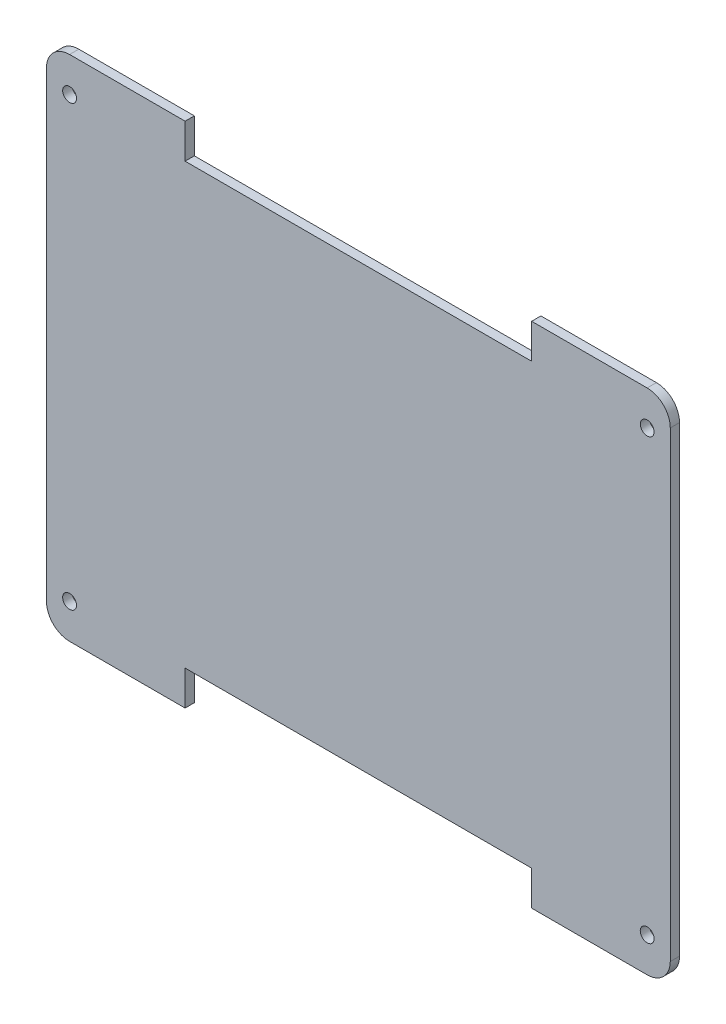
ISO-10303-21;
HEADER;
FILE_DESCRIPTION(('STEP AP214'),'2;1');
FILE_NAME('part.step','',(''),(''),'','','');
FILE_SCHEMA(('AUTOMOTIVE_DESIGN { 1 0 10303 214 1 1 1 1 }'));
ENDSEC;
DATA;
#1=APPLICATION_CONTEXT('core data for automotive mechanical design processes');
#2=APPLICATION_PROTOCOL_DEFINITION('international standard','automotive_design',2000,#1);
#3=PRODUCT_CONTEXT('',#1,'mechanical');
#4=PRODUCT('Part','Part','',(#3));
#5=PRODUCT_RELATED_PRODUCT_CATEGORY('part','',(#4));
#6=PRODUCT_DEFINITION_FORMATION('','',#4);
#7=PRODUCT_DEFINITION_CONTEXT('part definition',#1,'design');
#8=PRODUCT_DEFINITION('design','',#6,#7);
#9=PRODUCT_DEFINITION_SHAPE('','',#8);
#10=(LENGTH_UNIT() NAMED_UNIT(*) SI_UNIT(.MILLI.,.METRE.));
#11=(NAMED_UNIT(*) PLANE_ANGLE_UNIT() SI_UNIT($,.RADIAN.));
#12=(NAMED_UNIT(*) SI_UNIT($,.STERADIAN.) SOLID_ANGLE_UNIT());
#13=UNCERTAINTY_MEASURE_WITH_UNIT(LENGTH_MEASURE(1.E-05),#10,'distance_accuracy_value','');
#14=(GEOMETRIC_REPRESENTATION_CONTEXT(3) GLOBAL_UNCERTAINTY_ASSIGNED_CONTEXT((#13)) GLOBAL_UNIT_ASSIGNED_CONTEXT((#10,
#11,#12)) REPRESENTATION_CONTEXT('',''));
#15=CARTESIAN_POINT('',(0.,0.,0.));
#16=DIRECTION('',(0.,0.,1.));
#17=DIRECTION('',(1.,0.,0.));
#18=AXIS2_PLACEMENT_3D('',#15,#16,#17);
#19=CARTESIAN_POINT('',(-125.,100.,14.));
#20=DIRECTION('',(0.,0.,-1.));
#21=DIRECTION('',(-1.,0.,0.));
#22=AXIS2_PLACEMENT_3D('',#19,#20,#21);
#23=PLANE('',#22);
#24=DIRECTION('',(0.,1.,0.));
#25=VECTOR('',#24,1.);
#26=CARTESIAN_POINT('',(135.,50.,14.));
#27=LINE('',#26,#25);
#28=CARTESIAN_POINT('',(135.,-100.,14.));
#29=VERTEX_POINT('',#28);
#30=CARTESIAN_POINT('',(135.,99.9999999999999,14.));
#31=VERTEX_POINT('',#30);
#32=EDGE_CURVE('E144',#29,#31,#27,.T.);
#33=ORIENTED_EDGE('',*,*,#32,.T.);
#34=CARTESIAN_POINT('',(125.,99.9999999999999,14.));
#35=DIRECTION('',(0.,0.,1.));
#36=DIRECTION('',(-1.,0.,0.));
#37=AXIS2_PLACEMENT_3D('',#34,#35,#36);
#38=CIRCLE('',#37,10.);
#39=CARTESIAN_POINT('',(125.,110.,14.));
#40=VERTEX_POINT('',#39);
#41=EDGE_CURVE('E147',#31,#40,#38,.T.);
#42=ORIENTED_EDGE('',*,*,#41,.T.);
#43=DIRECTION('',(-1.,0.,0.));
#44=VECTOR('',#43,1.);
#45=CARTESIAN_POINT('',(75.,110.,14.));
#46=LINE('',#45,#44);
#47=CARTESIAN_POINT('',(75.,110.,14.));
#48=VERTEX_POINT('',#47);
#49=EDGE_CURVE('E150',#40,#48,#46,.T.);
#50=ORIENTED_EDGE('',*,*,#49,.T.);
#51=DIRECTION('',(0.,-1.,0.));
#52=VECTOR('',#51,1.);
#53=CARTESIAN_POINT('',(75.,110.,14.));
#54=LINE('',#53,#52);
#55=CARTESIAN_POINT('',(75.,95.,14.));
#56=VERTEX_POINT('',#55);
#57=EDGE_CURVE('E153',#48,#56,#54,.T.);
#58=ORIENTED_EDGE('',*,*,#57,.T.);
#59=DIRECTION('',(-1.,0.,0.));
#60=VECTOR('',#59,1.);
#61=CARTESIAN_POINT('',(-75.,95.,14.));
#62=LINE('',#61,#60);
#63=CARTESIAN_POINT('',(-75.,95.,14.));
#64=VERTEX_POINT('',#63);
#65=EDGE_CURVE('E156',#56,#64,#62,.T.);
#66=ORIENTED_EDGE('',*,*,#65,.T.);
#67=DIRECTION('',(0.,1.,0.));
#68=VECTOR('',#67,1.);
#69=CARTESIAN_POINT('',(-75.,110.,14.));
#70=LINE('',#69,#68);
#71=CARTESIAN_POINT('',(-75.,110.,14.));
#72=VERTEX_POINT('',#71);
#73=EDGE_CURVE('E159',#64,#72,#70,.T.);
#74=ORIENTED_EDGE('',*,*,#73,.T.);
#75=DIRECTION('',(-1.,0.,0.));
#76=VECTOR('',#75,1.);
#77=CARTESIAN_POINT('',(-125.,110.,14.));
#78=LINE('',#77,#76);
#79=CARTESIAN_POINT('',(-125.,110.,14.));
#80=VERTEX_POINT('',#79);
#81=EDGE_CURVE('E116',#72,#80,#78,.T.);
#82=ORIENTED_EDGE('',*,*,#81,.T.);
#83=CARTESIAN_POINT('',(-125.,100.,14.));
#84=DIRECTION('',(0.,0.,1.));
#85=DIRECTION('',(-1.,0.,0.));
#86=AXIS2_PLACEMENT_3D('',#83,#84,#85);
#87=CIRCLE('',#86,10.);
#88=CARTESIAN_POINT('',(-135.,100.,14.));
#89=VERTEX_POINT('',#88);
#90=EDGE_CURVE('E162',#80,#89,#87,.T.);
#91=ORIENTED_EDGE('',*,*,#90,.T.);
#92=DIRECTION('',(0.,-1.,0.));
#93=VECTOR('',#92,1.);
#94=CARTESIAN_POINT('',(-135.,50.,14.));
#95=LINE('',#94,#93);
#96=CARTESIAN_POINT('',(-135.,-100.,14.));
#97=VERTEX_POINT('',#96);
#98=EDGE_CURVE('E141',#89,#97,#95,.T.);
#99=ORIENTED_EDGE('',*,*,#98,.T.);
#100=CARTESIAN_POINT('',(-125.,-100.,14.));
#101=DIRECTION('',(0.,0.,1.));
#102=DIRECTION('',(1.,0.,0.));
#103=AXIS2_PLACEMENT_3D('',#100,#101,#102);
#104=CIRCLE('',#103,10.);
#105=CARTESIAN_POINT('',(-125.,-110.,14.));
#106=VERTEX_POINT('',#105);
#107=EDGE_CURVE('E529',#97,#106,#104,.T.);
#108=ORIENTED_EDGE('',*,*,#107,.T.);
#109=DIRECTION('',(1.,0.,0.));
#110=VECTOR('',#109,1.);
#111=CARTESIAN_POINT('',(-125.,-110.,14.));
#112=LINE('',#111,#110);
#113=CARTESIAN_POINT('',(-75.,-110.,14.));
#114=VERTEX_POINT('',#113);
#115=EDGE_CURVE('E550',#106,#114,#112,.T.);
#116=ORIENTED_EDGE('',*,*,#115,.T.);
#117=DIRECTION('',(0.,1.,0.));
#118=VECTOR('',#117,1.);
#119=CARTESIAN_POINT('',(-75.,-110.,14.));
#120=LINE('',#119,#118);
#121=CARTESIAN_POINT('',(-75.,-95.,14.));
#122=VERTEX_POINT('',#121);
#123=EDGE_CURVE('E553',#114,#122,#120,.T.);
#124=ORIENTED_EDGE('',*,*,#123,.T.);
#125=DIRECTION('',(1.,0.,0.));
#126=VECTOR('',#125,1.);
#127=CARTESIAN_POINT('',(-75.,-95.,14.));
#128=LINE('',#127,#126);
#129=CARTESIAN_POINT('',(75.,-95.,14.));
#130=VERTEX_POINT('',#129);
#131=EDGE_CURVE('E556',#122,#130,#128,.T.);
#132=ORIENTED_EDGE('',*,*,#131,.T.);
#133=DIRECTION('',(0.,-1.,0.));
#134=VECTOR('',#133,1.);
#135=CARTESIAN_POINT('',(75.,-110.,14.));
#136=LINE('',#135,#134);
#137=CARTESIAN_POINT('',(75.,-110.,14.));
#138=VERTEX_POINT('',#137);
#139=EDGE_CURVE('E198',#130,#138,#136,.T.);
#140=ORIENTED_EDGE('',*,*,#139,.T.);
#141=DIRECTION('',(1.,0.,0.));
#142=VECTOR('',#141,1.);
#143=CARTESIAN_POINT('',(75.,-110.,14.));
#144=LINE('',#143,#142);
#145=CARTESIAN_POINT('',(125.,-110.,14.));
#146=VERTEX_POINT('',#145);
#147=EDGE_CURVE('E190',#138,#146,#144,.T.);
#148=ORIENTED_EDGE('',*,*,#147,.T.);
#149=CARTESIAN_POINT('',(125.,-100.,14.));
#150=DIRECTION('',(0.,0.,1.));
#151=DIRECTION('',(1.,0.,0.));
#152=AXIS2_PLACEMENT_3D('',#149,#150,#151);
#153=CIRCLE('',#152,10.);
#154=EDGE_CURVE('E186',#146,#29,#153,.T.);
#155=ORIENTED_EDGE('',*,*,#154,.T.);
#156=EDGE_LOOP('',(#33,#42,#50,#58,#66,#74,#82,#91,#99,#108,#116,#124,#132,#140,#148,#155));
#157=FACE_BOUND('',#156,.T.);
#158=CARTESIAN_POINT('',(125.,95.,14.));
#159=DIRECTION('',(0.,0.,1.));
#160=DIRECTION('',(1.,0.,0.));
#161=AXIS2_PLACEMENT_3D('',#158,#159,#160);
#162=CIRCLE('',#161,2.99999999999999);
#163=CARTESIAN_POINT('',(128.,95.,14.));
#164=VERTEX_POINT('',#163);
#165=EDGE_CURVE('E205',#164,#164,#162,.T.);
#166=ORIENTED_EDGE('',*,*,#165,.F.);
#167=EDGE_LOOP('',(#166));
#168=FACE_BOUND('',#167,.T.);
#169=CARTESIAN_POINT('',(-125.,95.,14.));
#170=DIRECTION('',(0.,0.,1.));
#171=DIRECTION('',(1.,0.,0.));
#172=AXIS2_PLACEMENT_3D('',#169,#170,#171);
#173=CIRCLE('',#172,3.00000000000001);
#174=CARTESIAN_POINT('',(-122.,95.,14.));
#175=VERTEX_POINT('',#174);
#176=EDGE_CURVE('E230',#175,#175,#173,.T.);
#177=ORIENTED_EDGE('',*,*,#176,.F.);
#178=EDGE_LOOP('',(#177));
#179=FACE_BOUND('',#178,.T.);
#180=CARTESIAN_POINT('',(-125.,-95.,14.));
#181=DIRECTION('',(0.,0.,1.));
#182=DIRECTION('',(-1.,0.,0.));
#183=AXIS2_PLACEMENT_3D('',#180,#181,#182);
#184=CIRCLE('',#183,3.00000000000001);
#185=CARTESIAN_POINT('',(-128.,-95.,14.));
#186=VERTEX_POINT('',#185);
#187=EDGE_CURVE('E520',#186,#186,#184,.T.);
#188=ORIENTED_EDGE('',*,*,#187,.F.);
#189=EDGE_LOOP('',(#188));
#190=FACE_BOUND('',#189,.T.);
#191=CARTESIAN_POINT('',(125.,-95.,14.));
#192=DIRECTION('',(0.,0.,1.));
#193=DIRECTION('',(-1.,0.,0.));
#194=AXIS2_PLACEMENT_3D('',#191,#192,#193);
#195=CIRCLE('',#194,2.99999999999999);
#196=CARTESIAN_POINT('',(122.,-95.,14.));
#197=VERTEX_POINT('',#196);
#198=EDGE_CURVE('E523',#197,#197,#195,.T.);
#199=ORIENTED_EDGE('',*,*,#198,.F.);
#200=EDGE_LOOP('',(#199));
#201=FACE_BOUND('',#200,.T.);
#202=ADVANCED_FACE('F35',(#157,#168,#179,#190,#201),#23,.F.);
#203=CARTESIAN_POINT('',(-135.,50.,10.));
#204=DIRECTION('',(-1.,0.,0.));
#205=DIRECTION('',(0.,0.,1.));
#206=AXIS2_PLACEMENT_3D('',#203,#204,#205);
#207=PLANE('',#206);
#208=DIRECTION('',(0.,-1.,0.));
#209=VECTOR('',#208,1.);
#210=CARTESIAN_POINT('',(-135.,50.,10.));
#211=LINE('',#210,#209);
#212=CARTESIAN_POINT('',(-135.,100.,10.));
#213=VERTEX_POINT('',#212);
#214=CARTESIAN_POINT('',(-135.,-100.,10.));
#215=VERTEX_POINT('',#214);
#216=EDGE_CURVE('E164',#213,#215,#211,.T.);
#217=ORIENTED_EDGE('',*,*,#216,.T.);
#218=DIRECTION('',(0.,0.,1.));
#219=VECTOR('',#218,1.);
#220=CARTESIAN_POINT('',(-135.,-100.,10.));
#221=LINE('',#220,#219);
#222=EDGE_CURVE('E202',#215,#97,#221,.T.);
#223=ORIENTED_EDGE('',*,*,#222,.T.);
#224=ORIENTED_EDGE('',*,*,#98,.F.);
#225=DIRECTION('',(0.,0.,1.));
#226=VECTOR('',#225,1.);
#227=CARTESIAN_POINT('',(-135.,100.,10.));
#228=LINE('',#227,#226);
#229=EDGE_CURVE('E11',#213,#89,#228,.T.);
#230=ORIENTED_EDGE('',*,*,#229,.F.);
#231=EDGE_LOOP('',(#217,#223,#224,#230));
#232=FACE_BOUND('',#231,.T.);
#233=ADVANCED_FACE('F37',(#232),#207,.T.);
#234=CARTESIAN_POINT('',(-125.,100.,10.));
#235=DIRECTION('',(0.,0.,1.));
#236=DIRECTION('',(1.,0.,0.));
#237=AXIS2_PLACEMENT_3D('',#234,#235,#236);
#238=CYLINDRICAL_SURFACE('',#237,10.);
#239=ORIENTED_EDGE('',*,*,#90,.F.);
#240=DIRECTION('',(0.,0.,1.));
#241=VECTOR('',#240,1.);
#242=CARTESIAN_POINT('',(-125.,110.,10.));
#243=LINE('',#242,#241);
#244=CARTESIAN_POINT('',(-125.,110.,10.));
#245=VERTEX_POINT('',#244);
#246=EDGE_CURVE('E45',#245,#80,#243,.T.);
#247=ORIENTED_EDGE('',*,*,#246,.F.);
#248=CARTESIAN_POINT('',(-125.,100.,10.));
#249=DIRECTION('',(0.,0.,1.));
#250=DIRECTION('',(-1.,0.,0.));
#251=AXIS2_PLACEMENT_3D('',#248,#249,#250);
#252=CIRCLE('',#251,10.);
#253=EDGE_CURVE('E131',#245,#213,#252,.T.);
#254=ORIENTED_EDGE('',*,*,#253,.T.);
#255=ORIENTED_EDGE('',*,*,#229,.T.);
#256=EDGE_LOOP('',(#239,#247,#254,#255));
#257=FACE_BOUND('',#256,.T.);
#258=ADVANCED_FACE('F267',(#257),#238,.T.);
#259=CARTESIAN_POINT('',(-125.,110.,10.));
#260=DIRECTION('',(0.,1.,0.));
#261=DIRECTION('',(-1.,0.,0.));
#262=AXIS2_PLACEMENT_3D('',#259,#260,#261);
#263=PLANE('',#262);
#264=ORIENTED_EDGE('',*,*,#81,.F.);
#265=DIRECTION('',(0.,0.,1.));
#266=VECTOR('',#265,1.);
#267=CARTESIAN_POINT('',(-75.,110.,10.));
#268=LINE('',#267,#266);
#269=CARTESIAN_POINT('',(-75.,110.,10.));
#270=VERTEX_POINT('',#269);
#271=EDGE_CURVE('E111',#270,#72,#268,.T.);
#272=ORIENTED_EDGE('',*,*,#271,.F.);
#273=DIRECTION('',(-1.,0.,0.));
#274=VECTOR('',#273,1.);
#275=CARTESIAN_POINT('',(-125.,110.,10.));
#276=LINE('',#275,#274);
#277=EDGE_CURVE('E114',#270,#245,#276,.T.);
#278=ORIENTED_EDGE('',*,*,#277,.T.);
#279=ORIENTED_EDGE('',*,*,#246,.T.);
#280=EDGE_LOOP('',(#264,#272,#278,#279));
#281=FACE_BOUND('',#280,.T.);
#282=ADVANCED_FACE('F113',(#281),#263,.T.);
#283=CARTESIAN_POINT('',(-75.,110.,10.));
#284=DIRECTION('',(1.,0.,0.));
#285=DIRECTION('',(0.,0.,-1.));
#286=AXIS2_PLACEMENT_3D('',#283,#284,#285);
#287=PLANE('',#286);
#288=ORIENTED_EDGE('',*,*,#73,.F.);
#289=DIRECTION('',(0.,0.,1.));
#290=VECTOR('',#289,1.);
#291=CARTESIAN_POINT('',(-75.,95.,10.));
#292=LINE('',#291,#290);
#293=CARTESIAN_POINT('',(-75.,95.,10.));
#294=VERTEX_POINT('',#293);
#295=EDGE_CURVE('E121',#294,#64,#292,.T.);
#296=ORIENTED_EDGE('',*,*,#295,.F.);
#297=DIRECTION('',(0.,1.,0.));
#298=VECTOR('',#297,1.);
#299=CARTESIAN_POINT('',(-75.,110.,10.));
#300=LINE('',#299,#298);
#301=EDGE_CURVE('E129',#294,#270,#300,.T.);
#302=ORIENTED_EDGE('',*,*,#301,.T.);
#303=ORIENTED_EDGE('',*,*,#271,.T.);
#304=EDGE_LOOP('',(#288,#296,#302,#303));
#305=FACE_BOUND('',#304,.T.);
#306=ADVANCED_FACE('F133',(#305),#287,.T.);
#307=CARTESIAN_POINT('',(-75.,95.,10.));
#308=DIRECTION('',(0.,1.,0.));
#309=DIRECTION('',(0.,0.,1.));
#310=AXIS2_PLACEMENT_3D('',#307,#308,#309);
#311=PLANE('',#310);
#312=ORIENTED_EDGE('',*,*,#65,.F.);
#313=DIRECTION('',(0.,0.,1.));
#314=VECTOR('',#313,1.);
#315=CARTESIAN_POINT('',(75.,95.,10.));
#316=LINE('',#315,#314);
#317=CARTESIAN_POINT('',(75.,95.,10.));
#318=VERTEX_POINT('',#317);
#319=EDGE_CURVE('E168',#318,#56,#316,.T.);
#320=ORIENTED_EDGE('',*,*,#319,.F.);
#321=DIRECTION('',(-1.,0.,0.));
#322=VECTOR('',#321,1.);
#323=CARTESIAN_POINT('',(-75.,95.,10.));
#324=LINE('',#323,#322);
#325=EDGE_CURVE('E134',#318,#294,#324,.T.);
#326=ORIENTED_EDGE('',*,*,#325,.T.);
#327=ORIENTED_EDGE('',*,*,#295,.T.);
#328=EDGE_LOOP('',(#312,#320,#326,#327));
#329=FACE_BOUND('',#328,.T.);
#330=ADVANCED_FACE('F253',(#329),#311,.T.);
#331=CARTESIAN_POINT('',(75.,110.,10.));
#332=DIRECTION('',(-1.,0.,0.));
#333=DIRECTION('',(0.,-1.,0.));
#334=AXIS2_PLACEMENT_3D('',#331,#332,#333);
#335=PLANE('',#334);
#336=ORIENTED_EDGE('',*,*,#57,.F.);
#337=DIRECTION('',(0.,0.,1.));
#338=VECTOR('',#337,1.);
#339=CARTESIAN_POINT('',(75.,110.,10.));
#340=LINE('',#339,#338);
#341=CARTESIAN_POINT('',(75.,110.,10.));
#342=VERTEX_POINT('',#341);
#343=EDGE_CURVE('E170',#342,#48,#340,.T.);
#344=ORIENTED_EDGE('',*,*,#343,.F.);
#345=DIRECTION('',(0.,-1.,0.));
#346=VECTOR('',#345,1.);
#347=CARTESIAN_POINT('',(75.,110.,10.));
#348=LINE('',#347,#346);
#349=EDGE_CURVE('E136',#342,#318,#348,.T.);
#350=ORIENTED_EDGE('',*,*,#349,.T.);
#351=ORIENTED_EDGE('',*,*,#319,.T.);
#352=EDGE_LOOP('',(#336,#344,#350,#351));
#353=FACE_BOUND('',#352,.T.);
#354=ADVANCED_FACE('F247',(#353),#335,.T.);
#355=CARTESIAN_POINT('',(75.,110.,10.));
#356=DIRECTION('',(0.,1.,0.));
#357=DIRECTION('',(0.,0.,1.));
#358=AXIS2_PLACEMENT_3D('',#355,#356,#357);
#359=PLANE('',#358);
#360=ORIENTED_EDGE('',*,*,#49,.F.);
#361=DIRECTION('',(0.,0.,1.));
#362=VECTOR('',#361,1.);
#363=CARTESIAN_POINT('',(125.,110.,10.));
#364=LINE('',#363,#362);
#365=CARTESIAN_POINT('',(125.,110.,10.));
#366=VERTEX_POINT('',#365);
#367=EDGE_CURVE('E171',#366,#40,#364,.T.);
#368=ORIENTED_EDGE('',*,*,#367,.F.);
#369=DIRECTION('',(-1.,0.,0.));
#370=VECTOR('',#369,1.);
#371=CARTESIAN_POINT('',(75.,110.,10.));
#372=LINE('',#371,#370);
#373=EDGE_CURVE('E241',#366,#342,#372,.T.);
#374=ORIENTED_EDGE('',*,*,#373,.T.);
#375=ORIENTED_EDGE('',*,*,#343,.T.);
#376=EDGE_LOOP('',(#360,#368,#374,#375));
#377=FACE_BOUND('',#376,.T.);
#378=ADVANCED_FACE('F251',(#377),#359,.T.);
#379=CARTESIAN_POINT('',(125.,99.9999999999999,10.));
#380=DIRECTION('',(0.,0.,1.));
#381=DIRECTION('',(1.,0.,0.));
#382=AXIS2_PLACEMENT_3D('',#379,#380,#381);
#383=CYLINDRICAL_SURFACE('',#382,10.);
#384=ORIENTED_EDGE('',*,*,#41,.F.);
#385=DIRECTION('',(0.,0.,1.));
#386=VECTOR('',#385,1.);
#387=CARTESIAN_POINT('',(135.,99.9999999999999,10.));
#388=LINE('',#387,#386);
#389=CARTESIAN_POINT('',(135.,99.9999999999999,10.));
#390=VERTEX_POINT('',#389);
#391=EDGE_CURVE('E39',#390,#31,#388,.T.);
#392=ORIENTED_EDGE('',*,*,#391,.F.);
#393=CARTESIAN_POINT('',(125.,99.9999999999999,10.));
#394=DIRECTION('',(0.,0.,1.));
#395=DIRECTION('',(-1.,0.,0.));
#396=AXIS2_PLACEMENT_3D('',#393,#394,#395);
#397=CIRCLE('',#396,10.);
#398=EDGE_CURVE('E239',#390,#366,#397,.T.);
#399=ORIENTED_EDGE('',*,*,#398,.T.);
#400=ORIENTED_EDGE('',*,*,#367,.T.);
#401=EDGE_LOOP('',(#384,#392,#399,#400));
#402=FACE_BOUND('',#401,.T.);
#403=ADVANCED_FACE('F180',(#402),#383,.T.);
#404=CARTESIAN_POINT('',(135.,50.,10.));
#405=DIRECTION('',(1.,0.,0.));
#406=DIRECTION('',(0.,0.,-1.));
#407=AXIS2_PLACEMENT_3D('',#404,#405,#406);
#408=PLANE('',#407);
#409=DIRECTION('',(0.,1.,0.));
#410=VECTOR('',#409,1.);
#411=CARTESIAN_POINT('',(135.,50.,10.));
#412=LINE('',#411,#410);
#413=CARTESIAN_POINT('',(135.,-100.,10.));
#414=VERTEX_POINT('',#413);
#415=EDGE_CURVE('E94',#414,#390,#412,.T.);
#416=ORIENTED_EDGE('',*,*,#415,.T.);
#417=ORIENTED_EDGE('',*,*,#391,.T.);
#418=ORIENTED_EDGE('',*,*,#32,.F.);
#419=DIRECTION('',(0.,0.,1.));
#420=VECTOR('',#419,1.);
#421=CARTESIAN_POINT('',(135.,-100.,10.));
#422=LINE('',#421,#420);
#423=EDGE_CURVE('E206',#414,#29,#422,.T.);
#424=ORIENTED_EDGE('',*,*,#423,.F.);
#425=EDGE_LOOP('',(#416,#417,#418,#424));
#426=FACE_BOUND('',#425,.T.);
#427=ADVANCED_FACE('F177',(#426),#408,.T.);
#428=CARTESIAN_POINT('',(-125.,100.,10.));
#429=DIRECTION('',(0.,0.,-1.));
#430=DIRECTION('',(-1.,0.,0.));
#431=AXIS2_PLACEMENT_3D('',#428,#429,#430);
#432=PLANE('',#431);
#433=ORIENTED_EDGE('',*,*,#398,.F.);
#434=ORIENTED_EDGE('',*,*,#415,.F.);
#435=CARTESIAN_POINT('',(125.,-100.,10.));
#436=DIRECTION('',(0.,0.,1.));
#437=DIRECTION('',(1.,0.,0.));
#438=AXIS2_PLACEMENT_3D('',#435,#436,#437);
#439=CIRCLE('',#438,10.);
#440=CARTESIAN_POINT('',(125.,-110.,10.));
#441=VERTEX_POINT('',#440);
#442=EDGE_CURVE('E226',#441,#414,#439,.T.);
#443=ORIENTED_EDGE('',*,*,#442,.F.);
#444=DIRECTION('',(1.,0.,0.));
#445=VECTOR('',#444,1.);
#446=CARTESIAN_POINT('',(75.,-110.,10.));
#447=LINE('',#446,#445);
#448=CARTESIAN_POINT('',(75.,-110.,10.));
#449=VERTEX_POINT('',#448);
#450=EDGE_CURVE('E543',#449,#441,#447,.T.);
#451=ORIENTED_EDGE('',*,*,#450,.F.);
#452=DIRECTION('',(0.,-1.,0.));
#453=VECTOR('',#452,1.);
#454=CARTESIAN_POINT('',(75.,-110.,10.));
#455=LINE('',#454,#453);
#456=CARTESIAN_POINT('',(75.,-95.,10.));
#457=VERTEX_POINT('',#456);
#458=EDGE_CURVE('E540',#457,#449,#455,.T.);
#459=ORIENTED_EDGE('',*,*,#458,.F.);
#460=DIRECTION('',(1.,0.,0.));
#461=VECTOR('',#460,1.);
#462=CARTESIAN_POINT('',(-75.,-95.,10.));
#463=LINE('',#462,#461);
#464=CARTESIAN_POINT('',(-75.,-95.,10.));
#465=VERTEX_POINT('',#464);
#466=EDGE_CURVE('E537',#465,#457,#463,.T.);
#467=ORIENTED_EDGE('',*,*,#466,.F.);
#468=DIRECTION('',(0.,1.,0.));
#469=VECTOR('',#468,1.);
#470=CARTESIAN_POINT('',(-75.,-110.,10.));
#471=LINE('',#470,#469);
#472=CARTESIAN_POINT('',(-75.,-110.,10.));
#473=VERTEX_POINT('',#472);
#474=EDGE_CURVE('E534',#473,#465,#471,.T.);
#475=ORIENTED_EDGE('',*,*,#474,.F.);
#476=DIRECTION('',(1.,0.,0.));
#477=VECTOR('',#476,1.);
#478=CARTESIAN_POINT('',(-125.,-110.,10.));
#479=LINE('',#478,#477);
#480=CARTESIAN_POINT('',(-125.,-110.,10.));
#481=VERTEX_POINT('',#480);
#482=EDGE_CURVE('E196',#481,#473,#479,.T.);
#483=ORIENTED_EDGE('',*,*,#482,.F.);
#484=CARTESIAN_POINT('',(-125.,-100.,10.));
#485=DIRECTION('',(0.,0.,1.));
#486=DIRECTION('',(1.,0.,0.));
#487=AXIS2_PLACEMENT_3D('',#484,#485,#486);
#488=CIRCLE('',#487,10.);
#489=EDGE_CURVE('E193',#215,#481,#488,.T.);
#490=ORIENTED_EDGE('',*,*,#489,.F.);
#491=ORIENTED_EDGE('',*,*,#216,.F.);
#492=ORIENTED_EDGE('',*,*,#253,.F.);
#493=ORIENTED_EDGE('',*,*,#277,.F.);
#494=ORIENTED_EDGE('',*,*,#301,.F.);
#495=ORIENTED_EDGE('',*,*,#325,.F.);
#496=ORIENTED_EDGE('',*,*,#349,.F.);
#497=ORIENTED_EDGE('',*,*,#373,.F.);
#498=EDGE_LOOP('',(#433,#434,#443,#451,#459,#467,#475,#483,#490,#491,#492,#493,#494,#495,#496,#497));
#499=FACE_BOUND('',#498,.T.);
#500=CARTESIAN_POINT('',(125.,95.,10.));
#501=DIRECTION('',(0.,0.,1.));
#502=DIRECTION('',(1.,0.,0.));
#503=AXIS2_PLACEMENT_3D('',#500,#501,#502);
#504=CIRCLE('',#503,2.99999999999999);
#505=CARTESIAN_POINT('',(128.,95.,10.));
#506=VERTEX_POINT('',#505);
#507=EDGE_CURVE('E227',#506,#506,#504,.T.);
#508=ORIENTED_EDGE('',*,*,#507,.T.);
#509=EDGE_LOOP('',(#508));
#510=FACE_BOUND('',#509,.T.);
#511=CARTESIAN_POINT('',(-125.,95.,10.));
#512=DIRECTION('',(0.,0.,1.));
#513=DIRECTION('',(1.,0.,0.));
#514=AXIS2_PLACEMENT_3D('',#511,#512,#513);
#515=CIRCLE('',#514,3.00000000000001);
#516=CARTESIAN_POINT('',(-122.,95.,10.));
#517=VERTEX_POINT('',#516);
#518=EDGE_CURVE('E145',#517,#517,#515,.T.);
#519=ORIENTED_EDGE('',*,*,#518,.T.);
#520=EDGE_LOOP('',(#519));
#521=FACE_BOUND('',#520,.T.);
#522=CARTESIAN_POINT('',(-125.,-95.,10.));
#523=DIRECTION('',(0.,0.,1.));
#524=DIRECTION('',(-1.,0.,0.));
#525=AXIS2_PLACEMENT_3D('',#522,#523,#524);
#526=CIRCLE('',#525,3.00000000000001);
#527=CARTESIAN_POINT('',(-128.,-95.,10.));
#528=VERTEX_POINT('',#527);
#529=EDGE_CURVE('E517',#528,#528,#526,.T.);
#530=ORIENTED_EDGE('',*,*,#529,.T.);
#531=EDGE_LOOP('',(#530));
#532=FACE_BOUND('',#531,.T.);
#533=CARTESIAN_POINT('',(125.,-95.,10.));
#534=DIRECTION('',(0.,0.,1.));
#535=DIRECTION('',(-1.,0.,0.));
#536=AXIS2_PLACEMENT_3D('',#533,#534,#535);
#537=CIRCLE('',#536,2.99999999999999);
#538=CARTESIAN_POINT('',(122.,-95.,10.));
#539=VERTEX_POINT('',#538);
#540=EDGE_CURVE('E526',#539,#539,#537,.T.);
#541=ORIENTED_EDGE('',*,*,#540,.T.);
#542=EDGE_LOOP('',(#541));
#543=FACE_BOUND('',#542,.T.);
#544=ADVANCED_FACE('F126',(#499,#510,#521,#532,#543),#432,.T.);
#545=CARTESIAN_POINT('',(-125.,95.,10.));
#546=DIRECTION('',(0.,0.,1.));
#547=DIRECTION('',(1.,0.,0.));
#548=AXIS2_PLACEMENT_3D('',#545,#546,#547);
#549=CYLINDRICAL_SURFACE('',#548,3.00000000000001);
#550=ORIENTED_EDGE('',*,*,#518,.F.);
#551=EDGE_LOOP('',(#550));
#552=FACE_BOUND('',#551,.T.);
#553=ORIENTED_EDGE('',*,*,#176,.T.);
#554=EDGE_LOOP('',(#553));
#555=FACE_BOUND('',#554,.T.);
#556=ADVANCED_FACE('F303',(#552,#555),#549,.F.);
#557=CARTESIAN_POINT('',(125.,95.,10.));
#558=DIRECTION('',(0.,0.,1.));
#559=DIRECTION('',(1.,0.,0.));
#560=AXIS2_PLACEMENT_3D('',#557,#558,#559);
#561=CYLINDRICAL_SURFACE('',#560,2.99999999999999);
#562=ORIENTED_EDGE('',*,*,#507,.F.);
#563=EDGE_LOOP('',(#562));
#564=FACE_BOUND('',#563,.T.);
#565=ORIENTED_EDGE('',*,*,#165,.T.);
#566=EDGE_LOOP('',(#565));
#567=FACE_BOUND('',#566,.T.);
#568=ADVANCED_FACE('F299',(#564,#567),#561,.F.);
#569=CARTESIAN_POINT('',(-125.,-100.,10.));
#570=DIRECTION('',(0.,0.,1.));
#571=DIRECTION('',(1.,0.,0.));
#572=AXIS2_PLACEMENT_3D('',#569,#570,#571);
#573=CYLINDRICAL_SURFACE('',#572,10.);
#574=ORIENTED_EDGE('',*,*,#107,.F.);
#575=ORIENTED_EDGE('',*,*,#222,.F.);
#576=ORIENTED_EDGE('',*,*,#489,.T.);
#577=DIRECTION('',(0.,0.,1.));
#578=VECTOR('',#577,1.);
#579=CARTESIAN_POINT('',(-125.,-110.,10.));
#580=LINE('',#579,#578);
#581=EDGE_CURVE('E223',#481,#106,#580,.T.);
#582=ORIENTED_EDGE('',*,*,#581,.T.);
#583=EDGE_LOOP('',(#574,#575,#576,#582));
#584=FACE_BOUND('',#583,.T.);
#585=ADVANCED_FACE('F302',(#584),#573,.T.);
#586=CARTESIAN_POINT('',(125.,-100.,10.));
#587=DIRECTION('',(0.,0.,1.));
#588=DIRECTION('',(1.,0.,0.));
#589=AXIS2_PLACEMENT_3D('',#586,#587,#588);
#590=CYLINDRICAL_SURFACE('',#589,10.);
#591=ORIENTED_EDGE('',*,*,#154,.F.);
#592=DIRECTION('',(0.,0.,1.));
#593=VECTOR('',#592,1.);
#594=CARTESIAN_POINT('',(125.,-110.,10.));
#595=LINE('',#594,#593);
#596=EDGE_CURVE('E208',#441,#146,#595,.T.);
#597=ORIENTED_EDGE('',*,*,#596,.F.);
#598=ORIENTED_EDGE('',*,*,#442,.T.);
#599=ORIENTED_EDGE('',*,*,#423,.T.);
#600=EDGE_LOOP('',(#591,#597,#598,#599));
#601=FACE_BOUND('',#600,.T.);
#602=ADVANCED_FACE('F371',(#601),#590,.T.);
#603=CARTESIAN_POINT('',(75.,-110.,10.));
#604=DIRECTION('',(0.,-1.,0.));
#605=DIRECTION('',(0.,0.,-1.));
#606=AXIS2_PLACEMENT_3D('',#603,#604,#605);
#607=PLANE('',#606);
#608=ORIENTED_EDGE('',*,*,#147,.F.);
#609=DIRECTION('',(0.,0.,1.));
#610=VECTOR('',#609,1.);
#611=CARTESIAN_POINT('',(75.,-110.,10.));
#612=LINE('',#611,#610);
#613=EDGE_CURVE('E211',#449,#138,#612,.T.);
#614=ORIENTED_EDGE('',*,*,#613,.F.);
#615=ORIENTED_EDGE('',*,*,#450,.T.);
#616=ORIENTED_EDGE('',*,*,#596,.T.);
#617=EDGE_LOOP('',(#608,#614,#615,#616));
#618=FACE_BOUND('',#617,.T.);
#619=ADVANCED_FACE('F381',(#618),#607,.T.);
#620=CARTESIAN_POINT('',(75.,-110.,10.));
#621=DIRECTION('',(-1.,0.,0.));
#622=DIRECTION('',(0.,-1.,0.));
#623=AXIS2_PLACEMENT_3D('',#620,#621,#622);
#624=PLANE('',#623);
#625=ORIENTED_EDGE('',*,*,#139,.F.);
#626=DIRECTION('',(0.,0.,1.));
#627=VECTOR('',#626,1.);
#628=CARTESIAN_POINT('',(75.,-95.,10.));
#629=LINE('',#628,#627);
#630=EDGE_CURVE('E214',#457,#130,#629,.T.);
#631=ORIENTED_EDGE('',*,*,#630,.F.);
#632=ORIENTED_EDGE('',*,*,#458,.T.);
#633=ORIENTED_EDGE('',*,*,#613,.T.);
#634=EDGE_LOOP('',(#625,#631,#632,#633));
#635=FACE_BOUND('',#634,.T.);
#636=ADVANCED_FACE('F390',(#635),#624,.T.);
#637=CARTESIAN_POINT('',(-75.,-95.,10.));
#638=DIRECTION('',(0.,-1.,0.));
#639=DIRECTION('',(0.,0.,-1.));
#640=AXIS2_PLACEMENT_3D('',#637,#638,#639);
#641=PLANE('',#640);
#642=ORIENTED_EDGE('',*,*,#131,.F.);
#643=DIRECTION('',(0.,0.,1.));
#644=VECTOR('',#643,1.);
#645=CARTESIAN_POINT('',(-75.,-95.,10.));
#646=LINE('',#645,#644);
#647=EDGE_CURVE('E217',#465,#122,#646,.T.);
#648=ORIENTED_EDGE('',*,*,#647,.F.);
#649=ORIENTED_EDGE('',*,*,#466,.T.);
#650=ORIENTED_EDGE('',*,*,#630,.T.);
#651=EDGE_LOOP('',(#642,#648,#649,#650));
#652=FACE_BOUND('',#651,.T.);
#653=ADVANCED_FACE('F400',(#652),#641,.T.);
#654=CARTESIAN_POINT('',(-75.,-110.,10.));
#655=DIRECTION('',(1.,0.,0.));
#656=DIRECTION('',(0.,0.,-1.));
#657=AXIS2_PLACEMENT_3D('',#654,#655,#656);
#658=PLANE('',#657);
#659=ORIENTED_EDGE('',*,*,#123,.F.);
#660=DIRECTION('',(0.,0.,1.));
#661=VECTOR('',#660,1.);
#662=CARTESIAN_POINT('',(-75.,-110.,10.));
#663=LINE('',#662,#661);
#664=EDGE_CURVE('E220',#473,#114,#663,.T.);
#665=ORIENTED_EDGE('',*,*,#664,.F.);
#666=ORIENTED_EDGE('',*,*,#474,.T.);
#667=ORIENTED_EDGE('',*,*,#647,.T.);
#668=EDGE_LOOP('',(#659,#665,#666,#667));
#669=FACE_BOUND('',#668,.T.);
#670=ADVANCED_FACE('F410',(#669),#658,.T.);
#671=CARTESIAN_POINT('',(-125.,-110.,10.));
#672=DIRECTION('',(0.,-1.,0.));
#673=DIRECTION('',(1.,0.,0.));
#674=AXIS2_PLACEMENT_3D('',#671,#672,#673);
#675=PLANE('',#674);
#676=ORIENTED_EDGE('',*,*,#115,.F.);
#677=ORIENTED_EDGE('',*,*,#581,.F.);
#678=ORIENTED_EDGE('',*,*,#482,.T.);
#679=ORIENTED_EDGE('',*,*,#664,.T.);
#680=EDGE_LOOP('',(#676,#677,#678,#679));
#681=FACE_BOUND('',#680,.T.);
#682=ADVANCED_FACE('F420',(#681),#675,.T.);
#683=CARTESIAN_POINT('',(125.,-95.,10.));
#684=DIRECTION('',(0.,0.,1.));
#685=DIRECTION('',(1.,0.,0.));
#686=AXIS2_PLACEMENT_3D('',#683,#684,#685);
#687=CYLINDRICAL_SURFACE('',#686,2.99999999999999);
#688=ORIENTED_EDGE('',*,*,#540,.F.);
#689=EDGE_LOOP('',(#688));
#690=FACE_BOUND('',#689,.T.);
#691=ORIENTED_EDGE('',*,*,#198,.T.);
#692=EDGE_LOOP('',(#691));
#693=FACE_BOUND('',#692,.T.);
#694=ADVANCED_FACE('F430',(#690,#693),#687,.F.);
#695=CARTESIAN_POINT('',(-125.,-95.,10.));
#696=DIRECTION('',(0.,0.,1.));
#697=DIRECTION('',(1.,0.,0.));
#698=AXIS2_PLACEMENT_3D('',#695,#696,#697);
#699=CYLINDRICAL_SURFACE('',#698,3.00000000000001);
#700=ORIENTED_EDGE('',*,*,#529,.F.);
#701=EDGE_LOOP('',(#700));
#702=FACE_BOUND('',#701,.T.);
#703=ORIENTED_EDGE('',*,*,#187,.T.);
#704=EDGE_LOOP('',(#703));
#705=FACE_BOUND('',#704,.T.);
#706=ADVANCED_FACE('F440',(#702,#705),#699,.F.);
#707=CLOSED_SHELL('',(#202,#233,#258,#282,#306,#330,#354,#378,#403,#427,#544,#556,#568,#585,
#602,#619,#636,#653,#670,#682,#694,#706));
#708=MANIFOLD_SOLID_BREP('B2',#707);
#709=ADVANCED_BREP_SHAPE_REPRESENTATION('',(#18,#708),#14);
#710=SHAPE_DEFINITION_REPRESENTATION(#9,#709);
ENDSEC;
END-ISO-10303-21;
